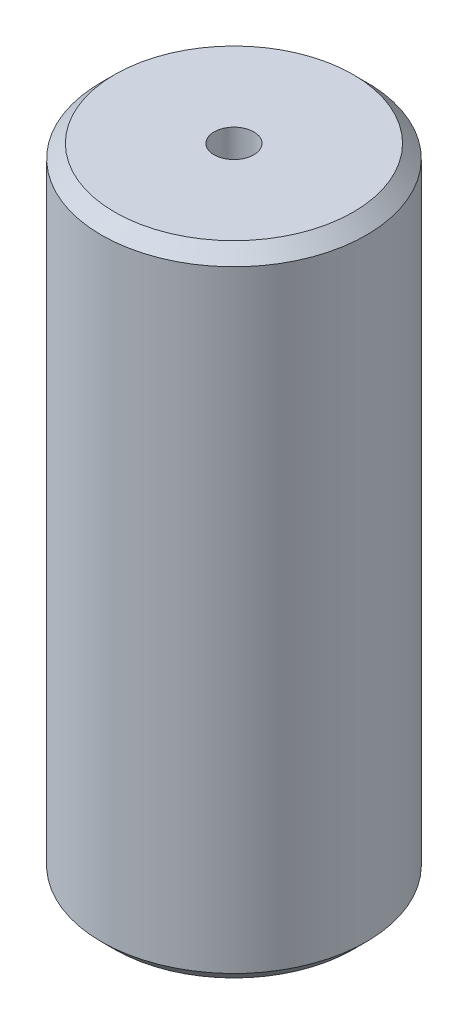
ISO-10303-21;
HEADER;
FILE_DESCRIPTION(('STEP AP214'),'2;1');
FILE_NAME('part.step','',(''),(''),'','','');
FILE_SCHEMA(('AUTOMOTIVE_DESIGN { 1 0 10303 214 1 1 1 1 }'));
ENDSEC;
DATA;
#1=APPLICATION_CONTEXT('core data for automotive mechanical design processes');
#2=APPLICATION_PROTOCOL_DEFINITION('international standard','automotive_design',2000,#1);
#3=PRODUCT_CONTEXT('',#1,'mechanical');
#4=PRODUCT('Part','Part','',(#3));
#5=PRODUCT_RELATED_PRODUCT_CATEGORY('part','',(#4));
#6=PRODUCT_DEFINITION_FORMATION('','',#4);
#7=PRODUCT_DEFINITION_CONTEXT('part definition',#1,'design');
#8=PRODUCT_DEFINITION('design','',#6,#7);
#9=PRODUCT_DEFINITION_SHAPE('','',#8);
#10=(LENGTH_UNIT() NAMED_UNIT(*) SI_UNIT(.MILLI.,.METRE.));
#11=(NAMED_UNIT(*) PLANE_ANGLE_UNIT() SI_UNIT($,.RADIAN.));
#12=(NAMED_UNIT(*) SI_UNIT($,.STERADIAN.) SOLID_ANGLE_UNIT());
#13=UNCERTAINTY_MEASURE_WITH_UNIT(LENGTH_MEASURE(1.E-05),#10,'distance_accuracy_value','');
#14=(GEOMETRIC_REPRESENTATION_CONTEXT(3) GLOBAL_UNCERTAINTY_ASSIGNED_CONTEXT((#13)) GLOBAL_UNIT_ASSIGNED_CONTEXT((#10,
#11,#12)) REPRESENTATION_CONTEXT('',''));
#15=CARTESIAN_POINT('',(0.,0.,0.));
#16=DIRECTION('',(0.,0.,1.));
#17=DIRECTION('',(1.,0.,0.));
#18=AXIS2_PLACEMENT_3D('',#15,#16,#17);
#19=CARTESIAN_POINT('',(0.,48.2,0.));
#20=DIRECTION('',(0.,1.,0.));
#21=DIRECTION('',(0.,0.,1.));
#22=AXIS2_PLACEMENT_3D('',#19,#20,#21);
#23=PLANE('',#22);
#24=CARTESIAN_POINT('',(0.,48.2,0.));
#25=DIRECTION('',(0.,1.,0.));
#26=DIRECTION('',(0.,0.,1.));
#27=AXIS2_PLACEMENT_3D('',#24,#25,#26);
#28=CIRCLE('',#27,9.00000000000001);
#29=CARTESIAN_POINT('',(0.,48.2,9.00000000000001));
#30=VERTEX_POINT('',#29);
#31=EDGE_CURVE('E10',#30,#30,#28,.T.);
#32=ORIENTED_EDGE('',*,*,#31,.T.);
#33=EDGE_LOOP('',(#32));
#34=FACE_BOUND('',#33,.T.);
#35=CARTESIAN_POINT('',(0.,48.2,0.));
#36=DIRECTION('',(0.,1.,0.));
#37=DIRECTION('',(0.,0.,1.));
#38=AXIS2_PLACEMENT_3D('',#35,#36,#37);
#39=CIRCLE('',#38,1.5);
#40=CARTESIAN_POINT('',(0.,48.2,1.5));
#41=VERTEX_POINT('',#40);
#42=EDGE_CURVE('E61',#41,#41,#39,.T.);
#43=ORIENTED_EDGE('',*,*,#42,.F.);
#44=EDGE_LOOP('',(#43));
#45=FACE_BOUND('',#44,.T.);
#46=ADVANCED_FACE('F40',(#34,#45),#23,.T.);
#47=CARTESIAN_POINT('',(0.,0.,0.));
#48=DIRECTION('',(0.,1.,0.));
#49=DIRECTION('',(0.,0.,1.));
#50=AXIS2_PLACEMENT_3D('',#47,#48,#49);
#51=PLANE('',#50);
#52=CARTESIAN_POINT('',(0.,0.,0.));
#53=DIRECTION('',(0.,1.,0.));
#54=DIRECTION('',(0.,0.,1.));
#55=AXIS2_PLACEMENT_3D('',#52,#53,#54);
#56=CIRCLE('',#55,9.00000000000001);
#57=CARTESIAN_POINT('',(0.,0.,9.00000000000001));
#58=VERTEX_POINT('',#57);
#59=EDGE_CURVE('E48',#58,#58,#56,.F.);
#60=ORIENTED_EDGE('',*,*,#59,.T.);
#61=EDGE_LOOP('',(#60));
#62=FACE_BOUND('',#61,.T.);
#63=CARTESIAN_POINT('',(0.,0.,0.));
#64=DIRECTION('',(0.,1.,0.));
#65=DIRECTION('',(0.,0.,1.));
#66=AXIS2_PLACEMENT_3D('',#63,#64,#65);
#67=CIRCLE('',#66,1.5);
#68=CARTESIAN_POINT('',(0.,0.,1.5));
#69=VERTEX_POINT('',#68);
#70=EDGE_CURVE('E62',#69,#69,#67,.T.);
#71=ORIENTED_EDGE('',*,*,#70,.T.);
#72=EDGE_LOOP('',(#71));
#73=FACE_BOUND('',#72,.T.);
#74=ADVANCED_FACE('F72',(#62,#73),#51,.F.);
#75=CARTESIAN_POINT('',(0.,48.2,0.));
#76=DIRECTION('',(0.,-1.,0.));
#77=DIRECTION('',(0.,0.,-1.));
#78=AXIS2_PLACEMENT_3D('',#75,#76,#77);
#79=CYLINDRICAL_SURFACE('',#78,10.);
#80=CARTESIAN_POINT('',(0.,0.999999999999994,0.));
#81=DIRECTION('',(0.,1.,0.));
#82=DIRECTION('',(0.,0.,1.));
#83=AXIS2_PLACEMENT_3D('',#80,#81,#82);
#84=CIRCLE('',#83,10.);
#85=CARTESIAN_POINT('',(0.,0.999999999999994,10.));
#86=VERTEX_POINT('',#85);
#87=EDGE_CURVE('E52',#86,#86,#84,.T.);
#88=ORIENTED_EDGE('',*,*,#87,.T.);
#89=EDGE_LOOP('',(#88));
#90=FACE_BOUND('',#89,.T.);
#91=CARTESIAN_POINT('',(0.,47.2,0.));
#92=DIRECTION('',(0.,1.,0.));
#93=DIRECTION('',(0.,0.,1.));
#94=AXIS2_PLACEMENT_3D('',#91,#92,#93);
#95=CIRCLE('',#94,10.);
#96=CARTESIAN_POINT('',(0.,47.2,10.));
#97=VERTEX_POINT('',#96);
#98=EDGE_CURVE('E56',#97,#97,#95,.F.);
#99=ORIENTED_EDGE('',*,*,#98,.T.);
#100=EDGE_LOOP('',(#99));
#101=FACE_BOUND('',#100,.T.);
#102=ADVANCED_FACE('F78',(#90,#101),#79,.T.);
#103=CARTESIAN_POINT('',(0.,48.2,0.));
#104=DIRECTION('',(0.,-1.,0.));
#105=DIRECTION('',(0.,0.,-1.));
#106=AXIS2_PLACEMENT_3D('',#103,#104,#105);
#107=CYLINDRICAL_SURFACE('',#106,1.5);
#108=ORIENTED_EDGE('',*,*,#42,.T.);
#109=EDGE_LOOP('',(#108));
#110=FACE_BOUND('',#109,.T.);
#111=ORIENTED_EDGE('',*,*,#70,.F.);
#112=EDGE_LOOP('',(#111));
#113=FACE_BOUND('',#112,.T.);
#114=ADVANCED_FACE('F68',(#110,#113),#107,.F.);
#115=CARTESIAN_POINT('',(0.,0.999999999999994,0.));
#116=DIRECTION('',(0.,1.,0.));
#117=DIRECTION('',(0.,0.,1.));
#118=AXIS2_PLACEMENT_3D('',#115,#116,#117);
#119=CONICAL_SURFACE('',#118,10.,0.785398163397449);
#120=ORIENTED_EDGE('',*,*,#59,.F.);
#121=EDGE_LOOP('',(#120));
#122=FACE_BOUND('',#121,.T.);
#123=ORIENTED_EDGE('',*,*,#87,.F.);
#124=EDGE_LOOP('',(#123));
#125=FACE_BOUND('',#124,.T.);
#126=ADVANCED_FACE('F85',(#122,#125),#119,.T.);
#127=CARTESIAN_POINT('',(0.,48.2,0.));
#128=DIRECTION('',(0.,-1.,0.));
#129=DIRECTION('',(0.,0.,-1.));
#130=AXIS2_PLACEMENT_3D('',#127,#128,#129);
#131=CONICAL_SURFACE('',#130,9.00000000000001,0.785398163397447);
#132=ORIENTED_EDGE('',*,*,#98,.F.);
#133=EDGE_LOOP('',(#132));
#134=FACE_BOUND('',#133,.T.);
#135=ORIENTED_EDGE('',*,*,#31,.F.);
#136=EDGE_LOOP('',(#135));
#137=FACE_BOUND('',#136,.T.);
#138=ADVANCED_FACE('F43',(#134,#137),#131,.T.);
#139=CLOSED_SHELL('',(#46,#74,#102,#114,#126,#138));
#140=MANIFOLD_SOLID_BREP('B2',#139);
#141=ADVANCED_BREP_SHAPE_REPRESENTATION('',(#18,#140),#14);
#142=SHAPE_DEFINITION_REPRESENTATION(#9,#141);
ENDSEC;
END-ISO-10303-21;
